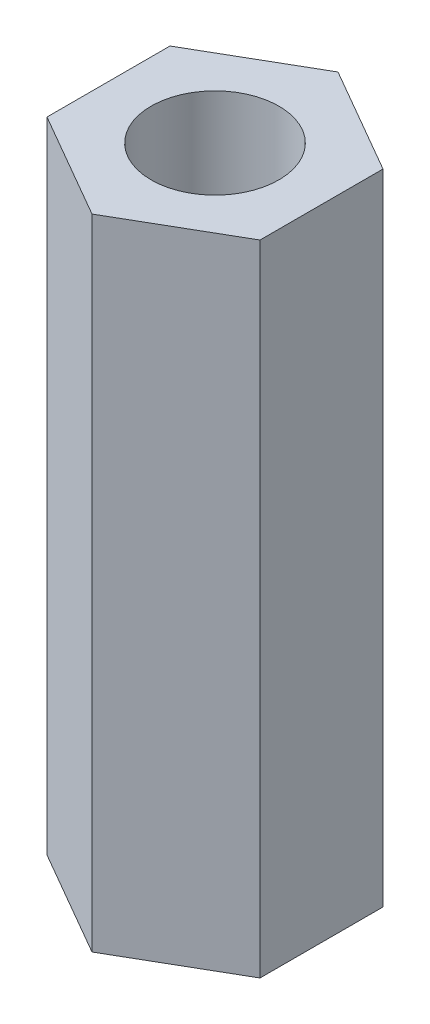
ISO-10303-21;
HEADER;
FILE_DESCRIPTION(('STEP AP214'),'2;1');
FILE_NAME('part.step','',(''),(''),'','','');
FILE_SCHEMA(('AUTOMOTIVE_DESIGN { 1 0 10303 214 1 1 1 1 }'));
ENDSEC;
DATA;
#1=APPLICATION_CONTEXT('core data for automotive mechanical design processes');
#2=APPLICATION_PROTOCOL_DEFINITION('international standard','automotive_design',2000,#1);
#3=PRODUCT_CONTEXT('',#1,'mechanical');
#4=PRODUCT('Part','Part','',(#3));
#5=PRODUCT_RELATED_PRODUCT_CATEGORY('part','',(#4));
#6=PRODUCT_DEFINITION_FORMATION('','',#4);
#7=PRODUCT_DEFINITION_CONTEXT('part definition',#1,'design');
#8=PRODUCT_DEFINITION('design','',#6,#7);
#9=PRODUCT_DEFINITION_SHAPE('','',#8);
#10=(LENGTH_UNIT() NAMED_UNIT(*) SI_UNIT(.MILLI.,.METRE.));
#11=(NAMED_UNIT(*) PLANE_ANGLE_UNIT() SI_UNIT($,.RADIAN.));
#12=(NAMED_UNIT(*) SI_UNIT($,.STERADIAN.) SOLID_ANGLE_UNIT());
#13=UNCERTAINTY_MEASURE_WITH_UNIT(LENGTH_MEASURE(1.E-05),#10,'distance_accuracy_value','');
#14=(GEOMETRIC_REPRESENTATION_CONTEXT(3) GLOBAL_UNCERTAINTY_ASSIGNED_CONTEXT((#13)) GLOBAL_UNIT_ASSIGNED_CONTEXT((#10,
#11,#12)) REPRESENTATION_CONTEXT('',''));
#15=CARTESIAN_POINT('',(0.,0.,0.));
#16=DIRECTION('',(0.,0.,1.));
#17=DIRECTION('',(1.,0.,0.));
#18=AXIS2_PLACEMENT_3D('',#15,#16,#17);
#19=CARTESIAN_POINT('',(0.,15.,0.));
#20=DIRECTION('',(0.,1.,0.));
#21=DIRECTION('',(0.,0.,1.));
#22=AXIS2_PLACEMENT_3D('',#19,#20,#21);
#23=PLANE('',#22);
#24=DIRECTION('',(0.866025403784441,0.,0.499999999999995));
#25=VECTOR('',#24,1.);
#26=CARTESIAN_POINT('',(-2.49999999999998,15.,1.44337567297409));
#27=LINE('',#26,#25);
#28=CARTESIAN_POINT('',(-2.49999999999998,15.,1.44337567297409));
#29=VERTEX_POINT('',#28);
#30=CARTESIAN_POINT('',(0.,15.,2.88675134594813));
#31=VERTEX_POINT('',#30);
#32=EDGE_CURVE('E133',#29,#31,#27,.T.);
#33=ORIENTED_EDGE('',*,*,#32,.T.);
#34=DIRECTION('',(0.866025403784438,0.,-0.500000000000001));
#35=VECTOR('',#34,1.);
#36=CARTESIAN_POINT('',(0.,15.,2.88675134594813));
#37=LINE('',#36,#35);
#38=CARTESIAN_POINT('',(2.50000000000001,15.,1.44337567297406));
#39=VERTEX_POINT('',#38);
#40=EDGE_CURVE('E91',#31,#39,#37,.T.);
#41=ORIENTED_EDGE('',*,*,#40,.T.);
#42=DIRECTION('',(0.,0.,-1.));
#43=VECTOR('',#42,1.);
#44=CARTESIAN_POINT('',(2.50000000000001,15.,1.44337567297406));
#45=LINE('',#44,#43);
#46=CARTESIAN_POINT('',(2.5,15.,-1.44337567297408));
#47=VERTEX_POINT('',#46);
#48=EDGE_CURVE('E104',#39,#47,#45,.T.);
#49=ORIENTED_EDGE('',*,*,#48,.T.);
#50=DIRECTION('',(-0.866025403784441,0.,-0.499999999999995));
#51=VECTOR('',#50,1.);
#52=CARTESIAN_POINT('',(2.5,15.,-1.44337567297408));
#53=LINE('',#52,#51);
#54=CARTESIAN_POINT('',(0.,15.,-2.88675134594813));
#55=VERTEX_POINT('',#54);
#56=EDGE_CURVE('E98',#47,#55,#53,.T.);
#57=ORIENTED_EDGE('',*,*,#56,.T.);
#58=DIRECTION('',(-0.866025403784434,0.,0.500000000000007));
#59=VECTOR('',#58,1.);
#60=CARTESIAN_POINT('',(0.,15.,-2.88675134594813));
#61=LINE('',#60,#59);
#62=CARTESIAN_POINT('',(-2.50000000000002,15.,-1.44337567297404));
#63=VERTEX_POINT('',#62);
#64=EDGE_CURVE('E102',#55,#63,#61,.T.);
#65=ORIENTED_EDGE('',*,*,#64,.T.);
#66=DIRECTION('',(0.,0.,1.));
#67=VECTOR('',#66,1.);
#68=CARTESIAN_POINT('',(-2.50000000000002,15.,-1.44337567297404));
#69=LINE('',#68,#67);
#70=EDGE_CURVE('E54',#63,#29,#69,.T.);
#71=ORIENTED_EDGE('',*,*,#70,.T.);
#72=EDGE_LOOP('',(#33,#41,#49,#57,#65,#71));
#73=FACE_BOUND('',#72,.T.);
#74=CARTESIAN_POINT('',(0.,15.,0.));
#75=DIRECTION('',(0.,1.,0.));
#76=DIRECTION('',(0.,0.,1.));
#77=AXIS2_PLACEMENT_3D('',#74,#75,#76);
#78=CIRCLE('',#77,1.5);
#79=CARTESIAN_POINT('',(0.,15.,1.5));
#80=VERTEX_POINT('',#79);
#81=EDGE_CURVE('E126',#80,#80,#78,.T.);
#82=ORIENTED_EDGE('',*,*,#81,.F.);
#83=EDGE_LOOP('',(#82));
#84=FACE_BOUND('',#83,.T.);
#85=ADVANCED_FACE('F37',(#73,#84),#23,.T.);
#86=CARTESIAN_POINT('',(0.,0.,0.));
#87=DIRECTION('',(0.,1.,0.));
#88=DIRECTION('',(0.,0.,1.));
#89=AXIS2_PLACEMENT_3D('',#86,#87,#88);
#90=PLANE('',#89);
#91=DIRECTION('',(0.866025403784441,0.,0.499999999999995));
#92=VECTOR('',#91,1.);
#93=CARTESIAN_POINT('',(-2.49999999999998,0.,1.44337567297409));
#94=LINE('',#93,#92);
#95=CARTESIAN_POINT('',(-2.49999999999998,0.,1.44337567297409));
#96=VERTEX_POINT('',#95);
#97=CARTESIAN_POINT('',(0.,0.,2.88675134594813));
#98=VERTEX_POINT('',#97);
#99=EDGE_CURVE('E122',#96,#98,#94,.T.);
#100=ORIENTED_EDGE('',*,*,#99,.F.);
#101=DIRECTION('',(0.,0.,1.));
#102=VECTOR('',#101,1.);
#103=CARTESIAN_POINT('',(-2.50000000000002,0.,-1.44337567297404));
#104=LINE('',#103,#102);
#105=CARTESIAN_POINT('',(-2.50000000000002,0.,-1.44337567297404));
#106=VERTEX_POINT('',#105);
#107=EDGE_CURVE('E83',#106,#96,#104,.T.);
#108=ORIENTED_EDGE('',*,*,#107,.F.);
#109=DIRECTION('',(-0.866025403784434,0.,0.500000000000007));
#110=VECTOR('',#109,1.);
#111=CARTESIAN_POINT('',(0.,0.,-2.88675134594813));
#112=LINE('',#111,#110);
#113=CARTESIAN_POINT('',(0.,0.,-2.88675134594813));
#114=VERTEX_POINT('',#113);
#115=EDGE_CURVE('E77',#114,#106,#112,.T.);
#116=ORIENTED_EDGE('',*,*,#115,.F.);
#117=DIRECTION('',(-0.866025403784441,0.,-0.499999999999995));
#118=VECTOR('',#117,1.);
#119=CARTESIAN_POINT('',(2.5,0.,-1.44337567297408));
#120=LINE('',#119,#118);
#121=CARTESIAN_POINT('',(2.5,0.,-1.44337567297408));
#122=VERTEX_POINT('',#121);
#123=EDGE_CURVE('E112',#122,#114,#120,.T.);
#124=ORIENTED_EDGE('',*,*,#123,.F.);
#125=DIRECTION('',(0.,0.,-1.));
#126=VECTOR('',#125,1.);
#127=CARTESIAN_POINT('',(2.50000000000001,0.,1.44337567297406));
#128=LINE('',#127,#126);
#129=CARTESIAN_POINT('',(2.50000000000001,0.,1.44337567297406));
#130=VERTEX_POINT('',#129);
#131=EDGE_CURVE('E128',#130,#122,#128,.T.);
#132=ORIENTED_EDGE('',*,*,#131,.F.);
#133=DIRECTION('',(0.866025403784438,0.,-0.500000000000001));
#134=VECTOR('',#133,1.);
#135=CARTESIAN_POINT('',(0.,0.,2.88675134594813));
#136=LINE('',#135,#134);
#137=EDGE_CURVE('E125',#98,#130,#136,.T.);
#138=ORIENTED_EDGE('',*,*,#137,.F.);
#139=EDGE_LOOP('',(#100,#108,#116,#124,#132,#138));
#140=FACE_BOUND('',#139,.T.);
#141=CARTESIAN_POINT('',(0.,0.,0.));
#142=DIRECTION('',(0.,1.,0.));
#143=DIRECTION('',(0.,0.,1.));
#144=AXIS2_PLACEMENT_3D('',#141,#142,#143);
#145=CIRCLE('',#144,1.5);
#146=CARTESIAN_POINT('',(0.,0.,1.5));
#147=VERTEX_POINT('',#146);
#148=EDGE_CURVE('E226',#147,#147,#145,.T.);
#149=ORIENTED_EDGE('',*,*,#148,.T.);
#150=EDGE_LOOP('',(#149));
#151=FACE_BOUND('',#150,.T.);
#152=ADVANCED_FACE('F142',(#140,#151),#90,.F.);
#153=CARTESIAN_POINT('',(-2.49999999999998,15.,1.44337567297409));
#154=DIRECTION('',(0.499999999999995,0.,-0.866025403784441));
#155=DIRECTION('',(-0.866025403784441,0.,-0.499999999999995));
#156=AXIS2_PLACEMENT_3D('',#153,#154,#155);
#157=PLANE('',#156);
#158=ORIENTED_EDGE('',*,*,#99,.T.);
#159=DIRECTION('',(0.,-1.,0.));
#160=VECTOR('',#159,1.);
#161=CARTESIAN_POINT('',(0.,15.,2.88675134594813));
#162=LINE('',#161,#160);
#163=EDGE_CURVE('E11',#31,#98,#162,.T.);
#164=ORIENTED_EDGE('',*,*,#163,.F.);
#165=ORIENTED_EDGE('',*,*,#32,.F.);
#166=DIRECTION('',(0.,-1.,0.));
#167=VECTOR('',#166,1.);
#168=CARTESIAN_POINT('',(-2.49999999999998,15.,1.44337567297409));
#169=LINE('',#168,#167);
#170=EDGE_CURVE('E118',#29,#96,#169,.T.);
#171=ORIENTED_EDGE('',*,*,#170,.T.);
#172=EDGE_LOOP('',(#158,#164,#165,#171));
#173=FACE_BOUND('',#172,.T.);
#174=ADVANCED_FACE('F39',(#173),#157,.F.);
#175=CARTESIAN_POINT('',(0.,15.,2.88675134594813));
#176=DIRECTION('',(-0.500000000000001,0.,-0.866025403784438));
#177=DIRECTION('',(-0.866025403784438,0.,0.500000000000001));
#178=AXIS2_PLACEMENT_3D('',#175,#176,#177);
#179=PLANE('',#178);
#180=ORIENTED_EDGE('',*,*,#137,.T.);
#181=DIRECTION('',(0.,-1.,0.));
#182=VECTOR('',#181,1.);
#183=CARTESIAN_POINT('',(2.50000000000001,15.,1.44337567297406));
#184=LINE('',#183,#182);
#185=EDGE_CURVE('E46',#39,#130,#184,.T.);
#186=ORIENTED_EDGE('',*,*,#185,.F.);
#187=ORIENTED_EDGE('',*,*,#40,.F.);
#188=ORIENTED_EDGE('',*,*,#163,.T.);
#189=EDGE_LOOP('',(#180,#186,#187,#188));
#190=FACE_BOUND('',#189,.T.);
#191=ADVANCED_FACE('F167',(#190),#179,.F.);
#192=CARTESIAN_POINT('',(2.50000000000001,15.,1.44337567297406));
#193=DIRECTION('',(-1.,0.,0.));
#194=DIRECTION('',(0.,0.,1.));
#195=AXIS2_PLACEMENT_3D('',#192,#193,#194);
#196=PLANE('',#195);
#197=ORIENTED_EDGE('',*,*,#131,.T.);
#198=DIRECTION('',(0.,-1.,0.));
#199=VECTOR('',#198,1.);
#200=CARTESIAN_POINT('',(2.5,15.,-1.44337567297408));
#201=LINE('',#200,#199);
#202=EDGE_CURVE('E113',#47,#122,#201,.T.);
#203=ORIENTED_EDGE('',*,*,#202,.F.);
#204=ORIENTED_EDGE('',*,*,#48,.F.);
#205=ORIENTED_EDGE('',*,*,#185,.T.);
#206=EDGE_LOOP('',(#197,#203,#204,#205));
#207=FACE_BOUND('',#206,.T.);
#208=ADVANCED_FACE('F139',(#207),#196,.F.);
#209=CARTESIAN_POINT('',(2.5,15.,-1.44337567297408));
#210=DIRECTION('',(-0.499999999999995,0.,0.866025403784441));
#211=DIRECTION('',(0.866025403784442,0.,0.499999999999995));
#212=AXIS2_PLACEMENT_3D('',#209,#210,#211);
#213=PLANE('',#212);
#214=ORIENTED_EDGE('',*,*,#123,.T.);
#215=DIRECTION('',(0.,-1.,0.));
#216=VECTOR('',#215,1.);
#217=CARTESIAN_POINT('',(0.,15.,-2.88675134594813));
#218=LINE('',#217,#216);
#219=EDGE_CURVE('E109',#55,#114,#218,.T.);
#220=ORIENTED_EDGE('',*,*,#219,.F.);
#221=ORIENTED_EDGE('',*,*,#56,.F.);
#222=ORIENTED_EDGE('',*,*,#202,.T.);
#223=EDGE_LOOP('',(#214,#220,#221,#222));
#224=FACE_BOUND('',#223,.T.);
#225=ADVANCED_FACE('F110',(#224),#213,.F.);
#226=CARTESIAN_POINT('',(0.,15.,-2.88675134594813));
#227=DIRECTION('',(0.500000000000007,0.,0.866025403784435));
#228=DIRECTION('',(0.866025403784435,0.,-0.500000000000007));
#229=AXIS2_PLACEMENT_3D('',#226,#227,#228);
#230=PLANE('',#229);
#231=ORIENTED_EDGE('',*,*,#115,.T.);
#232=DIRECTION('',(0.,-1.,0.));
#233=VECTOR('',#232,1.);
#234=CARTESIAN_POINT('',(-2.50000000000002,15.,-1.44337567297404));
#235=LINE('',#234,#233);
#236=EDGE_CURVE('E114',#63,#106,#235,.T.);
#237=ORIENTED_EDGE('',*,*,#236,.F.);
#238=ORIENTED_EDGE('',*,*,#64,.F.);
#239=ORIENTED_EDGE('',*,*,#219,.T.);
#240=EDGE_LOOP('',(#231,#237,#238,#239));
#241=FACE_BOUND('',#240,.T.);
#242=ADVANCED_FACE('F116',(#241),#230,.F.);
#243=CARTESIAN_POINT('',(-2.50000000000002,15.,-1.44337567297404));
#244=DIRECTION('',(1.,0.,0.));
#245=DIRECTION('',(0.,0.,-1.));
#246=AXIS2_PLACEMENT_3D('',#243,#244,#245);
#247=PLANE('',#246);
#248=ORIENTED_EDGE('',*,*,#107,.T.);
#249=ORIENTED_EDGE('',*,*,#170,.F.);
#250=ORIENTED_EDGE('',*,*,#70,.F.);
#251=ORIENTED_EDGE('',*,*,#236,.T.);
#252=EDGE_LOOP('',(#248,#249,#250,#251));
#253=FACE_BOUND('',#252,.T.);
#254=ADVANCED_FACE('F147',(#253),#247,.F.);
#255=CARTESIAN_POINT('',(0.,15.,0.));
#256=DIRECTION('',(0.,-1.,0.));
#257=DIRECTION('',(0.,0.,-1.));
#258=AXIS2_PLACEMENT_3D('',#255,#256,#257);
#259=CYLINDRICAL_SURFACE('',#258,1.5);
#260=ORIENTED_EDGE('',*,*,#81,.T.);
#261=EDGE_LOOP('',(#260));
#262=FACE_BOUND('',#261,.T.);
#263=ORIENTED_EDGE('',*,*,#148,.F.);
#264=EDGE_LOOP('',(#263));
#265=FACE_BOUND('',#264,.T.);
#266=ADVANCED_FACE('F149',(#262,#265),#259,.F.);
#267=CLOSED_SHELL('',(#85,#152,#174,#191,#208,#225,#242,#254,#266));
#268=MANIFOLD_SOLID_BREP('B2',#267);
#269=ADVANCED_BREP_SHAPE_REPRESENTATION('',(#18,#268),#14);
#270=SHAPE_DEFINITION_REPRESENTATION(#9,#269);
ENDSEC;
END-ISO-10303-21;
